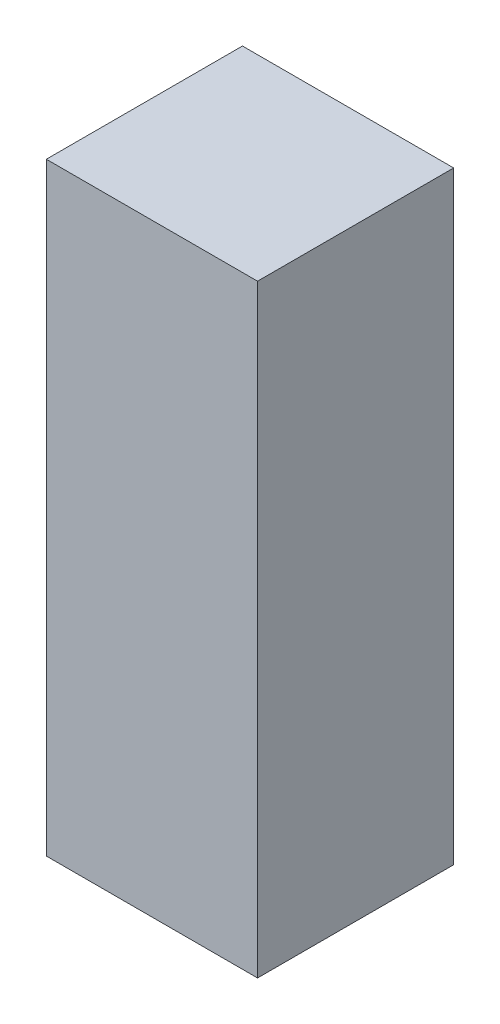
ISO-10303-21;
HEADER;
FILE_DESCRIPTION(('STEP AP214'),'2;1');
FILE_NAME('part.step','',(''),(''),'','','');
FILE_SCHEMA(('AUTOMOTIVE_DESIGN { 1 0 10303 214 1 1 1 1 }'));
ENDSEC;
DATA;
#1=APPLICATION_CONTEXT('core data for automotive mechanical design processes');
#2=APPLICATION_PROTOCOL_DEFINITION('international standard','automotive_design',2000,#1);
#3=PRODUCT_CONTEXT('',#1,'mechanical');
#4=PRODUCT('Part','Part','',(#3));
#5=PRODUCT_RELATED_PRODUCT_CATEGORY('part','',(#4));
#6=PRODUCT_DEFINITION_FORMATION('','',#4);
#7=PRODUCT_DEFINITION_CONTEXT('part definition',#1,'design');
#8=PRODUCT_DEFINITION('design','',#6,#7);
#9=PRODUCT_DEFINITION_SHAPE('','',#8);
#10=(LENGTH_UNIT() NAMED_UNIT(*) SI_UNIT(.MILLI.,.METRE.));
#11=(NAMED_UNIT(*) PLANE_ANGLE_UNIT() SI_UNIT($,.RADIAN.));
#12=(NAMED_UNIT(*) SI_UNIT($,.STERADIAN.) SOLID_ANGLE_UNIT());
#13=UNCERTAINTY_MEASURE_WITH_UNIT(LENGTH_MEASURE(1.E-05),#10,'distance_accuracy_value','');
#14=(GEOMETRIC_REPRESENTATION_CONTEXT(3) GLOBAL_UNCERTAINTY_ASSIGNED_CONTEXT((#13)) GLOBAL_UNIT_ASSIGNED_CONTEXT((#10,
#11,#12)) REPRESENTATION_CONTEXT('',''));
#15=CARTESIAN_POINT('',(0.,0.,0.));
#16=DIRECTION('',(0.,0.,1.));
#17=DIRECTION('',(1.,0.,0.));
#18=AXIS2_PLACEMENT_3D('',#15,#16,#17);
#19=CARTESIAN_POINT('',(24.,860.,33.));
#20=DIRECTION('',(1.,0.,0.));
#21=DIRECTION('',(0.,0.,-1.));
#22=AXIS2_PLACEMENT_3D('',#19,#20,#21);
#23=PLANE('',#22);
#24=DIRECTION('',(0.,-1.,0.));
#25=VECTOR('',#24,1.);
#26=CARTESIAN_POINT('',(24.,860.,20.));
#27=LINE('',#26,#25);
#28=CARTESIAN_POINT('',(24.,900.,20.));
#29=VERTEX_POINT('',#28);
#30=CARTESIAN_POINT('',(24.,860.,20.));
#31=VERTEX_POINT('',#30);
#32=EDGE_CURVE('E102',#29,#31,#27,.T.);
#33=ORIENTED_EDGE('',*,*,#32,.T.);
#34=DIRECTION('',(0.,0.,-1.));
#35=VECTOR('',#34,1.);
#36=CARTESIAN_POINT('',(24.,860.,33.));
#37=LINE('',#36,#35);
#38=CARTESIAN_POINT('',(24.,860.,33.));
#39=VERTEX_POINT('',#38);
#40=EDGE_CURVE('E11',#39,#31,#37,.T.);
#41=ORIENTED_EDGE('',*,*,#40,.F.);
#42=DIRECTION('',(0.,-1.,0.));
#43=VECTOR('',#42,1.);
#44=CARTESIAN_POINT('',(24.,860.,33.));
#45=LINE('',#44,#43);
#46=CARTESIAN_POINT('',(24.,900.,33.));
#47=VERTEX_POINT('',#46);
#48=EDGE_CURVE('E90',#47,#39,#45,.T.);
#49=ORIENTED_EDGE('',*,*,#48,.F.);
#50=DIRECTION('',(0.,0.,-1.));
#51=VECTOR('',#50,1.);
#52=CARTESIAN_POINT('',(24.,900.,33.));
#53=LINE('',#52,#51);
#54=EDGE_CURVE('E98',#47,#29,#53,.T.);
#55=ORIENTED_EDGE('',*,*,#54,.T.);
#56=EDGE_LOOP('',(#33,#41,#49,#55));
#57=FACE_BOUND('',#56,.T.);
#58=ADVANCED_FACE('F39',(#57),#23,.F.);
#59=CARTESIAN_POINT('',(24.,860.,33.));
#60=DIRECTION('',(0.,1.,0.));
#61=DIRECTION('',(0.,0.,1.));
#62=AXIS2_PLACEMENT_3D('',#59,#60,#61);
#63=PLANE('',#62);
#64=DIRECTION('',(1.,0.,0.));
#65=VECTOR('',#64,1.);
#66=CARTESIAN_POINT('',(24.,860.,20.));
#67=LINE('',#66,#65);
#68=CARTESIAN_POINT('',(38.,860.,20.));
#69=VERTEX_POINT('',#68);
#70=EDGE_CURVE('E94',#31,#69,#67,.T.);
#71=ORIENTED_EDGE('',*,*,#70,.T.);
#72=DIRECTION('',(0.,0.,-1.));
#73=VECTOR('',#72,1.);
#74=CARTESIAN_POINT('',(38.,860.,33.));
#75=LINE('',#74,#73);
#76=CARTESIAN_POINT('',(38.,860.,33.));
#77=VERTEX_POINT('',#76);
#78=EDGE_CURVE('E47',#77,#69,#75,.T.);
#79=ORIENTED_EDGE('',*,*,#78,.F.);
#80=DIRECTION('',(1.,0.,0.));
#81=VECTOR('',#80,1.);
#82=CARTESIAN_POINT('',(24.,860.,33.));
#83=LINE('',#82,#81);
#84=EDGE_CURVE('E85',#39,#77,#83,.T.);
#85=ORIENTED_EDGE('',*,*,#84,.F.);
#86=ORIENTED_EDGE('',*,*,#40,.T.);
#87=EDGE_LOOP('',(#71,#79,#85,#86));
#88=FACE_BOUND('',#87,.T.);
#89=ADVANCED_FACE('F93',(#88),#63,.F.);
#90=CARTESIAN_POINT('',(38.,860.,33.));
#91=DIRECTION('',(-1.,0.,0.));
#92=DIRECTION('',(0.,0.,1.));
#93=AXIS2_PLACEMENT_3D('',#90,#91,#92);
#94=PLANE('',#93);
#95=DIRECTION('',(0.,1.,0.));
#96=VECTOR('',#95,1.);
#97=CARTESIAN_POINT('',(38.,860.,20.));
#98=LINE('',#97,#96);
#99=CARTESIAN_POINT('',(38.,900.,20.));
#100=VERTEX_POINT('',#99);
#101=EDGE_CURVE('E72',#69,#100,#98,.T.);
#102=ORIENTED_EDGE('',*,*,#101,.T.);
#103=DIRECTION('',(0.,0.,-1.));
#104=VECTOR('',#103,1.);
#105=CARTESIAN_POINT('',(38.,900.,33.));
#106=LINE('',#105,#104);
#107=CARTESIAN_POINT('',(38.,900.,33.));
#108=VERTEX_POINT('',#107);
#109=EDGE_CURVE('E95',#108,#100,#106,.T.);
#110=ORIENTED_EDGE('',*,*,#109,.F.);
#111=DIRECTION('',(0.,1.,0.));
#112=VECTOR('',#111,1.);
#113=CARTESIAN_POINT('',(38.,860.,33.));
#114=LINE('',#113,#112);
#115=EDGE_CURVE('E88',#77,#108,#114,.T.);
#116=ORIENTED_EDGE('',*,*,#115,.F.);
#117=ORIENTED_EDGE('',*,*,#78,.T.);
#118=EDGE_LOOP('',(#102,#110,#116,#117));
#119=FACE_BOUND('',#118,.T.);
#120=ADVANCED_FACE('F96',(#119),#94,.F.);
#121=CARTESIAN_POINT('',(24.,900.,33.));
#122=DIRECTION('',(0.,-1.,0.));
#123=DIRECTION('',(0.,0.,-1.));
#124=AXIS2_PLACEMENT_3D('',#121,#122,#123);
#125=PLANE('',#124);
#126=DIRECTION('',(-1.,0.,0.));
#127=VECTOR('',#126,1.);
#128=CARTESIAN_POINT('',(24.,900.,20.));
#129=LINE('',#128,#127);
#130=EDGE_CURVE('E78',#100,#29,#129,.T.);
#131=ORIENTED_EDGE('',*,*,#130,.T.);
#132=ORIENTED_EDGE('',*,*,#54,.F.);
#133=DIRECTION('',(-1.,0.,0.));
#134=VECTOR('',#133,1.);
#135=CARTESIAN_POINT('',(24.,900.,33.));
#136=LINE('',#135,#134);
#137=EDGE_CURVE('E55',#108,#47,#136,.T.);
#138=ORIENTED_EDGE('',*,*,#137,.F.);
#139=ORIENTED_EDGE('',*,*,#109,.T.);
#140=EDGE_LOOP('',(#131,#132,#138,#139));
#141=FACE_BOUND('',#140,.T.);
#142=ADVANCED_FACE('F109',(#141),#125,.F.);
#143=CARTESIAN_POINT('',(0.,0.,33.));
#144=DIRECTION('',(0.,0.,-1.));
#145=DIRECTION('',(-1.,0.,0.));
#146=AXIS2_PLACEMENT_3D('',#143,#144,#145);
#147=PLANE('',#146);
#148=ORIENTED_EDGE('',*,*,#48,.T.);
#149=ORIENTED_EDGE('',*,*,#84,.T.);
#150=ORIENTED_EDGE('',*,*,#115,.T.);
#151=ORIENTED_EDGE('',*,*,#137,.T.);
#152=EDGE_LOOP('',(#148,#149,#150,#151));
#153=FACE_BOUND('',#152,.T.);
#154=ADVANCED_FACE('F86',(#153),#147,.F.);
#155=CARTESIAN_POINT('',(0.,0.,20.));
#156=DIRECTION('',(0.,0.,-1.));
#157=DIRECTION('',(-1.,0.,0.));
#158=AXIS2_PLACEMENT_3D('',#155,#156,#157);
#159=PLANE('',#158);
#160=ORIENTED_EDGE('',*,*,#32,.F.);
#161=ORIENTED_EDGE('',*,*,#130,.F.);
#162=ORIENTED_EDGE('',*,*,#101,.F.);
#163=ORIENTED_EDGE('',*,*,#70,.F.);
#164=EDGE_LOOP('',(#160,#161,#162,#163));
#165=FACE_BOUND('',#164,.T.);
#166=ADVANCED_FACE('F112',(#165),#159,.T.);
#167=CLOSED_SHELL('',(#58,#89,#120,#142,#154,#166));
#168=MANIFOLD_SOLID_BREP('B2',#167);
#169=ADVANCED_BREP_SHAPE_REPRESENTATION('',(#18,#168),#14);
#170=SHAPE_DEFINITION_REPRESENTATION(#9,#169);
ENDSEC;
END-ISO-10303-21;
